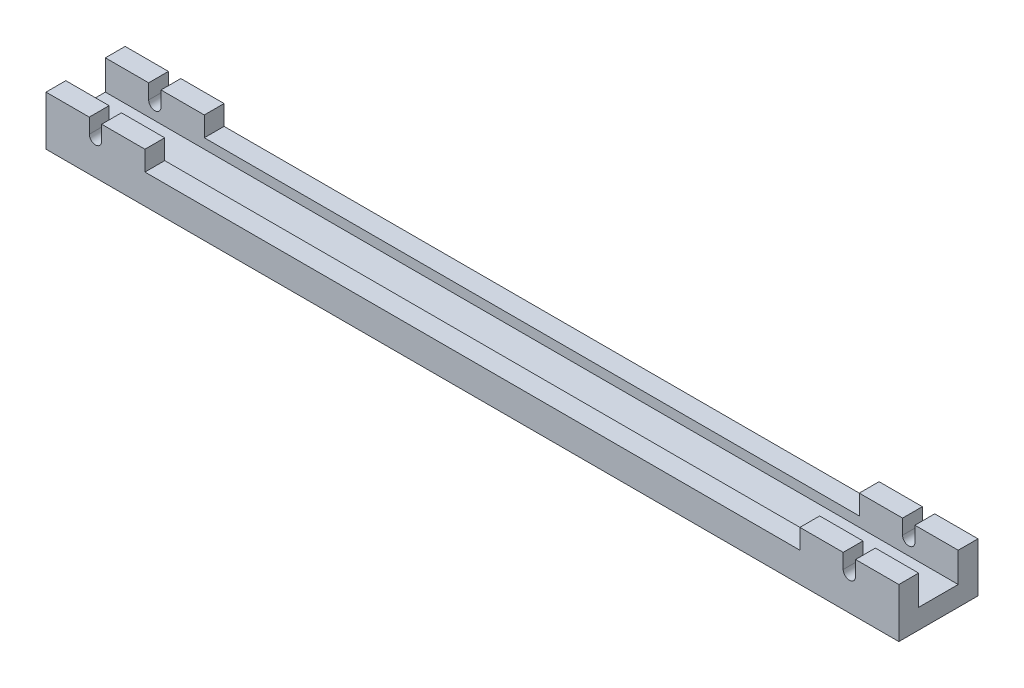
ISO-10303-21;
HEADER;
FILE_DESCRIPTION(('STEP AP214'),'2;1');
FILE_NAME('part.step','',(''),(''),'','','');
FILE_SCHEMA(('AUTOMOTIVE_DESIGN { 1 0 10303 214 1 1 1 1 }'));
ENDSEC;
DATA;
#1=APPLICATION_CONTEXT('core data for automotive mechanical design processes');
#2=APPLICATION_PROTOCOL_DEFINITION('international standard','automotive_design',2000,#1);
#3=PRODUCT_CONTEXT('',#1,'mechanical');
#4=PRODUCT('Part','Part','',(#3));
#5=PRODUCT_RELATED_PRODUCT_CATEGORY('part','',(#4));
#6=PRODUCT_DEFINITION_FORMATION('','',#4);
#7=PRODUCT_DEFINITION_CONTEXT('part definition',#1,'design');
#8=PRODUCT_DEFINITION('design','',#6,#7);
#9=PRODUCT_DEFINITION_SHAPE('','',#8);
#10=(LENGTH_UNIT() NAMED_UNIT(*) SI_UNIT(.MILLI.,.METRE.));
#11=(NAMED_UNIT(*) PLANE_ANGLE_UNIT() SI_UNIT($,.RADIAN.));
#12=(NAMED_UNIT(*) SI_UNIT($,.STERADIAN.) SOLID_ANGLE_UNIT());
#13=UNCERTAINTY_MEASURE_WITH_UNIT(LENGTH_MEASURE(1.E-05),#10,'distance_accuracy_value','');
#14=(GEOMETRIC_REPRESENTATION_CONTEXT(3) GLOBAL_UNCERTAINTY_ASSIGNED_CONTEXT((#13)) GLOBAL_UNIT_ASSIGNED_CONTEXT((#10,
#11,#12)) REPRESENTATION_CONTEXT('',''));
#15=CARTESIAN_POINT('',(0.,0.,0.));
#16=DIRECTION('',(0.,0.,1.));
#17=DIRECTION('',(1.,0.,0.));
#18=AXIS2_PLACEMENT_3D('',#15,#16,#17);
#19=CARTESIAN_POINT('',(0.,2.,4.));
#20=DIRECTION('',(0.,0.,-1.));
#21=DIRECTION('',(-1.,0.,0.));
#22=AXIS2_PLACEMENT_3D('',#19,#20,#21);
#23=PLANE('',#22);
#24=DIRECTION('',(0.,1.,0.));
#25=VECTOR('',#24,1.);
#26=CARTESIAN_POINT('',(-38.725,3.5,4.));
#27=LINE('',#26,#25);
#28=CARTESIAN_POINT('',(-38.725,3.5,4.));
#29=VERTEX_POINT('',#28);
#30=CARTESIAN_POINT('',(-38.725,5.,4.));
#31=VERTEX_POINT('',#30);
#32=EDGE_CURVE('E260',#29,#31,#27,.T.);
#33=ORIENTED_EDGE('',*,*,#32,.T.);
#34=DIRECTION('',(-1.,0.,0.));
#35=VECTOR('',#34,1.);
#36=CARTESIAN_POINT('',(-43.1,5.,4.));
#37=LINE('',#36,#35);
#38=CARTESIAN_POINT('',(-43.1,5.,4.));
#39=VERTEX_POINT('',#38);
#40=EDGE_CURVE('E317',#31,#39,#37,.T.);
#41=ORIENTED_EDGE('',*,*,#40,.T.);
#42=DIRECTION('',(0.,-1.,0.));
#43=VECTOR('',#42,1.);
#44=CARTESIAN_POINT('',(-43.1,2.,4.));
#45=LINE('',#44,#43);
#46=CARTESIAN_POINT('',(-43.1,0.,4.));
#47=VERTEX_POINT('',#46);
#48=EDGE_CURVE('E341',#39,#47,#45,.T.);
#49=ORIENTED_EDGE('',*,*,#48,.T.);
#50=DIRECTION('',(1.,0.,0.));
#51=VECTOR('',#50,1.);
#52=CARTESIAN_POINT('',(0.,0.,4.));
#53=LINE('',#52,#51);
#54=CARTESIAN_POINT('',(43.1,0.,4.));
#55=VERTEX_POINT('',#54);
#56=EDGE_CURVE('E457',#47,#55,#53,.T.);
#57=ORIENTED_EDGE('',*,*,#56,.T.);
#58=DIRECTION('',(0.,-1.,0.));
#59=VECTOR('',#58,1.);
#60=CARTESIAN_POINT('',(43.1,2.,4.));
#61=LINE('',#60,#59);
#62=CARTESIAN_POINT('',(43.1,5.,4.));
#63=VERTEX_POINT('',#62);
#64=EDGE_CURVE('E469',#63,#55,#61,.T.);
#65=ORIENTED_EDGE('',*,*,#64,.F.);
#66=DIRECTION('',(1.,0.,0.));
#67=VECTOR('',#66,1.);
#68=CARTESIAN_POINT('',(43.1,5.,4.));
#69=LINE('',#68,#67);
#70=CARTESIAN_POINT('',(38.725,5.,4.));
#71=VERTEX_POINT('',#70);
#72=EDGE_CURVE('E444',#71,#63,#69,.T.);
#73=ORIENTED_EDGE('',*,*,#72,.F.);
#74=DIRECTION('',(0.,1.,0.));
#75=VECTOR('',#74,1.);
#76=CARTESIAN_POINT('',(38.725,3.5,4.));
#77=LINE('',#76,#75);
#78=CARTESIAN_POINT('',(38.725,3.5,4.));
#79=VERTEX_POINT('',#78);
#80=EDGE_CURVE('E363',#79,#71,#77,.T.);
#81=ORIENTED_EDGE('',*,*,#80,.F.);
#82=CARTESIAN_POINT('',(38.1,3.5,4.));
#83=DIRECTION('',(0.,0.,1.));
#84=DIRECTION('',(1.,0.,0.));
#85=AXIS2_PLACEMENT_3D('',#82,#83,#84);
#86=CIRCLE('',#85,0.625000000000001);
#87=CARTESIAN_POINT('',(37.475,3.5,4.));
#88=VERTEX_POINT('',#87);
#89=EDGE_CURVE('E349',#88,#79,#86,.T.);
#90=ORIENTED_EDGE('',*,*,#89,.F.);
#91=DIRECTION('',(0.,-1.,0.));
#92=VECTOR('',#91,1.);
#93=CARTESIAN_POINT('',(37.475,3.5,4.));
#94=LINE('',#93,#92);
#95=CARTESIAN_POINT('',(37.475,5.,4.));
#96=VERTEX_POINT('',#95);
#97=EDGE_CURVE('E354',#96,#88,#94,.T.);
#98=ORIENTED_EDGE('',*,*,#97,.F.);
#99=CARTESIAN_POINT('',(33.1,5.,4.));
#100=VERTEX_POINT('',#99);
#101=EDGE_CURVE('E445',#100,#96,#69,.T.);
#102=ORIENTED_EDGE('',*,*,#101,.F.);
#103=DIRECTION('',(0.,-1.,0.));
#104=VECTOR('',#103,1.);
#105=CARTESIAN_POINT('',(33.1,5.,4.));
#106=LINE('',#105,#104);
#107=CARTESIAN_POINT('',(33.1,3.,4.));
#108=VERTEX_POINT('',#107);
#109=EDGE_CURVE('E448',#100,#108,#106,.T.);
#110=ORIENTED_EDGE('',*,*,#109,.T.);
#111=DIRECTION('',(1.,0.,0.));
#112=VECTOR('',#111,1.);
#113=CARTESIAN_POINT('',(0.,3.,4.));
#114=LINE('',#113,#112);
#115=CARTESIAN_POINT('',(-33.1,3.,4.));
#116=VERTEX_POINT('',#115);
#117=EDGE_CURVE('E402',#116,#108,#114,.T.);
#118=ORIENTED_EDGE('',*,*,#117,.F.);
#119=DIRECTION('',(0.,-1.,0.));
#120=VECTOR('',#119,1.);
#121=CARTESIAN_POINT('',(-33.1,5.,4.));
#122=LINE('',#121,#120);
#123=CARTESIAN_POINT('',(-33.1,5.,4.));
#124=VERTEX_POINT('',#123);
#125=EDGE_CURVE('E334',#124,#116,#122,.T.);
#126=ORIENTED_EDGE('',*,*,#125,.F.);
#127=CARTESIAN_POINT('',(-37.475,5.,4.));
#128=VERTEX_POINT('',#127);
#129=EDGE_CURVE('E318',#124,#128,#37,.T.);
#130=ORIENTED_EDGE('',*,*,#129,.T.);
#131=DIRECTION('',(0.,-1.,0.));
#132=VECTOR('',#131,1.);
#133=CARTESIAN_POINT('',(-37.475,3.5,4.));
#134=LINE('',#133,#132);
#135=CARTESIAN_POINT('',(-37.475,3.5,4.));
#136=VERTEX_POINT('',#135);
#137=EDGE_CURVE('E46',#128,#136,#134,.T.);
#138=ORIENTED_EDGE('',*,*,#137,.T.);
#139=CARTESIAN_POINT('',(-38.1,3.5,4.));
#140=DIRECTION('',(0.,0.,-1.));
#141=DIRECTION('',(-1.,0.,0.));
#142=AXIS2_PLACEMENT_3D('',#139,#140,#141);
#143=CIRCLE('',#142,0.625000000000001);
#144=EDGE_CURVE('E266',#136,#29,#143,.T.);
#145=ORIENTED_EDGE('',*,*,#144,.T.);
#146=EDGE_LOOP('',(#33,#41,#49,#57,#65,#73,#81,#90,#98,#102,#110,#118,#126,#130,#138,#145));
#147=FACE_BOUND('',#146,.T.);
#148=ADVANCED_FACE('F32',(#147),#23,.F.);
#149=CARTESIAN_POINT('',(0.,2.,-4.));
#150=DIRECTION('',(0.,0.,1.));
#151=DIRECTION('',(1.,0.,0.));
#152=AXIS2_PLACEMENT_3D('',#149,#150,#151);
#153=PLANE('',#152);
#154=DIRECTION('',(0.,1.,0.));
#155=VECTOR('',#154,1.);
#156=CARTESIAN_POINT('',(-38.725,3.5,-4.));
#157=LINE('',#156,#155);
#158=CARTESIAN_POINT('',(-38.725,3.5,-4.));
#159=VERTEX_POINT('',#158);
#160=CARTESIAN_POINT('',(-38.725,5.,-4.));
#161=VERTEX_POINT('',#160);
#162=EDGE_CURVE('E246',#159,#161,#157,.T.);
#163=ORIENTED_EDGE('',*,*,#162,.F.);
#164=CARTESIAN_POINT('',(-38.1,3.5,-4.));
#165=DIRECTION('',(0.,0.,-1.));
#166=DIRECTION('',(-1.,0.,0.));
#167=AXIS2_PLACEMENT_3D('',#164,#165,#166);
#168=CIRCLE('',#167,0.625000000000001);
#169=CARTESIAN_POINT('',(-37.475,3.5,-4.));
#170=VERTEX_POINT('',#169);
#171=EDGE_CURVE('E247',#170,#159,#168,.T.);
#172=ORIENTED_EDGE('',*,*,#171,.F.);
#173=DIRECTION('',(0.,-1.,0.));
#174=VECTOR('',#173,1.);
#175=CARTESIAN_POINT('',(-37.475,3.5,-4.));
#176=LINE('',#175,#174);
#177=CARTESIAN_POINT('',(-37.475,5.,-4.));
#178=VERTEX_POINT('',#177);
#179=EDGE_CURVE('E238',#178,#170,#176,.T.);
#180=ORIENTED_EDGE('',*,*,#179,.F.);
#181=DIRECTION('',(1.,0.,0.));
#182=VECTOR('',#181,1.);
#183=CARTESIAN_POINT('',(-43.1,5.,-4.));
#184=LINE('',#183,#182);
#185=CARTESIAN_POINT('',(-33.1,5.,-4.));
#186=VERTEX_POINT('',#185);
#187=EDGE_CURVE('E302',#178,#186,#184,.T.);
#188=ORIENTED_EDGE('',*,*,#187,.T.);
#189=DIRECTION('',(0.,-1.,0.));
#190=VECTOR('',#189,1.);
#191=CARTESIAN_POINT('',(-33.1,5.,-4.));
#192=LINE('',#191,#190);
#193=CARTESIAN_POINT('',(-33.1,3.,-4.));
#194=VERTEX_POINT('',#193);
#195=EDGE_CURVE('E305',#186,#194,#192,.T.);
#196=ORIENTED_EDGE('',*,*,#195,.T.);
#197=DIRECTION('',(-1.,0.,0.));
#198=VECTOR('',#197,1.);
#199=CARTESIAN_POINT('',(0.,3.,-4.));
#200=LINE('',#199,#198);
#201=CARTESIAN_POINT('',(33.1,3.,-4.));
#202=VERTEX_POINT('',#201);
#203=EDGE_CURVE('E400',#202,#194,#200,.T.);
#204=ORIENTED_EDGE('',*,*,#203,.F.);
#205=DIRECTION('',(0.,-1.,0.));
#206=VECTOR('',#205,1.);
#207=CARTESIAN_POINT('',(33.1,5.,-4.));
#208=LINE('',#207,#206);
#209=CARTESIAN_POINT('',(33.1,5.,-4.));
#210=VERTEX_POINT('',#209);
#211=EDGE_CURVE('E431',#210,#202,#208,.T.);
#212=ORIENTED_EDGE('',*,*,#211,.F.);
#213=DIRECTION('',(-1.,0.,0.));
#214=VECTOR('',#213,1.);
#215=CARTESIAN_POINT('',(43.1,5.,-4.));
#216=LINE('',#215,#214);
#217=CARTESIAN_POINT('',(37.475,5.,-4.));
#218=VERTEX_POINT('',#217);
#219=EDGE_CURVE('E414',#218,#210,#216,.T.);
#220=ORIENTED_EDGE('',*,*,#219,.F.);
#221=DIRECTION('',(0.,-1.,0.));
#222=VECTOR('',#221,1.);
#223=CARTESIAN_POINT('',(37.475,3.5,-4.));
#224=LINE('',#223,#222);
#225=CARTESIAN_POINT('',(37.475,3.5,-4.));
#226=VERTEX_POINT('',#225);
#227=EDGE_CURVE('E357',#218,#226,#224,.T.);
#228=ORIENTED_EDGE('',*,*,#227,.T.);
#229=CARTESIAN_POINT('',(38.1,3.5,-4.));
#230=DIRECTION('',(0.,0.,1.));
#231=DIRECTION('',(1.,0.,0.));
#232=AXIS2_PLACEMENT_3D('',#229,#230,#231);
#233=CIRCLE('',#232,0.625000000000001);
#234=CARTESIAN_POINT('',(38.725,3.5,-4.));
#235=VERTEX_POINT('',#234);
#236=EDGE_CURVE('E350',#226,#235,#233,.T.);
#237=ORIENTED_EDGE('',*,*,#236,.T.);
#238=DIRECTION('',(0.,1.,0.));
#239=VECTOR('',#238,1.);
#240=CARTESIAN_POINT('',(38.725,3.5,-4.));
#241=LINE('',#240,#239);
#242=CARTESIAN_POINT('',(38.725,5.,-4.));
#243=VERTEX_POINT('',#242);
#244=EDGE_CURVE('E353',#235,#243,#241,.T.);
#245=ORIENTED_EDGE('',*,*,#244,.T.);
#246=CARTESIAN_POINT('',(43.1,5.,-4.));
#247=VERTEX_POINT('',#246);
#248=EDGE_CURVE('E415',#247,#243,#216,.T.);
#249=ORIENTED_EDGE('',*,*,#248,.F.);
#250=DIRECTION('',(0.,-1.,0.));
#251=VECTOR('',#250,1.);
#252=CARTESIAN_POINT('',(43.1,2.,-4.));
#253=LINE('',#252,#251);
#254=CARTESIAN_POINT('',(43.1,0.,-4.));
#255=VERTEX_POINT('',#254);
#256=EDGE_CURVE('E461',#247,#255,#253,.T.);
#257=ORIENTED_EDGE('',*,*,#256,.T.);
#258=DIRECTION('',(-1.,0.,0.));
#259=VECTOR('',#258,1.);
#260=CARTESIAN_POINT('',(0.,0.,-4.));
#261=LINE('',#260,#259);
#262=CARTESIAN_POINT('',(-43.1,0.,-4.));
#263=VERTEX_POINT('',#262);
#264=EDGE_CURVE('E462',#255,#263,#261,.T.);
#265=ORIENTED_EDGE('',*,*,#264,.T.);
#266=DIRECTION('',(0.,-1.,0.));
#267=VECTOR('',#266,1.);
#268=CARTESIAN_POINT('',(-43.1,2.,-4.));
#269=LINE('',#268,#267);
#270=CARTESIAN_POINT('',(-43.1,5.,-4.));
#271=VERTEX_POINT('',#270);
#272=EDGE_CURVE('E346',#271,#263,#269,.T.);
#273=ORIENTED_EDGE('',*,*,#272,.F.);
#274=EDGE_CURVE('E303',#271,#161,#184,.T.);
#275=ORIENTED_EDGE('',*,*,#274,.T.);
#276=EDGE_LOOP('',(#163,#172,#180,#188,#196,#204,#212,#220,#228,#237,#245,#249,#257,#265,#273,#275));
#277=FACE_BOUND('',#276,.T.);
#278=ADVANCED_FACE('F258',(#277),#153,.F.);
#279=CARTESIAN_POINT('',(43.1,5.,2.));
#280=DIRECTION('',(0.,0.,1.));
#281=DIRECTION('',(1.,0.,0.));
#282=AXIS2_PLACEMENT_3D('',#279,#280,#281);
#283=PLANE('',#282);
#284=DIRECTION('',(0.,1.,0.));
#285=VECTOR('',#284,1.);
#286=CARTESIAN_POINT('',(-38.725,5.,2.00000000000001));
#287=LINE('',#286,#285);
#288=CARTESIAN_POINT('',(-38.725,3.5,2.00000000000001));
#289=VERTEX_POINT('',#288);
#290=CARTESIAN_POINT('',(-38.725,5.,2.));
#291=VERTEX_POINT('',#290);
#292=EDGE_CURVE('E282',#289,#291,#287,.T.);
#293=ORIENTED_EDGE('',*,*,#292,.F.);
#294=CARTESIAN_POINT('',(-38.1,3.5,2.00000000000001));
#295=DIRECTION('',(0.,0.,1.));
#296=DIRECTION('',(1.,0.,0.));
#297=AXIS2_PLACEMENT_3D('',#294,#295,#296);
#298=CIRCLE('',#297,0.625000000000001);
#299=CARTESIAN_POINT('',(-37.475,3.5,2.00000000000001));
#300=VERTEX_POINT('',#299);
#301=EDGE_CURVE('E284',#300,#289,#298,.F.);
#302=ORIENTED_EDGE('',*,*,#301,.F.);
#303=DIRECTION('',(0.,-1.,0.));
#304=VECTOR('',#303,1.);
#305=CARTESIAN_POINT('',(-37.475,5.,2.00000000000001));
#306=LINE('',#305,#304);
#307=CARTESIAN_POINT('',(-37.475,5.,2.));
#308=VERTEX_POINT('',#307);
#309=EDGE_CURVE('E278',#308,#300,#306,.T.);
#310=ORIENTED_EDGE('',*,*,#309,.F.);
#311=DIRECTION('',(1.,0.,0.));
#312=VECTOR('',#311,1.);
#313=CARTESIAN_POINT('',(-43.1,5.,2.));
#314=LINE('',#313,#312);
#315=CARTESIAN_POINT('',(-33.1,5.,2.));
#316=VERTEX_POINT('',#315);
#317=EDGE_CURVE('E324',#308,#316,#314,.T.);
#318=ORIENTED_EDGE('',*,*,#317,.T.);
#319=DIRECTION('',(0.,-1.,0.));
#320=VECTOR('',#319,1.);
#321=CARTESIAN_POINT('',(-33.1,5.,2.));
#322=LINE('',#321,#320);
#323=CARTESIAN_POINT('',(-33.1,3.,2.));
#324=VERTEX_POINT('',#323);
#325=EDGE_CURVE('E331',#316,#324,#322,.T.);
#326=ORIENTED_EDGE('',*,*,#325,.T.);
#327=DIRECTION('',(-1.,0.,0.));
#328=VECTOR('',#327,1.);
#329=CARTESIAN_POINT('',(0.,3.,2.));
#330=LINE('',#329,#328);
#331=CARTESIAN_POINT('',(33.1,3.,2.));
#332=VERTEX_POINT('',#331);
#333=EDGE_CURVE('E408',#332,#324,#330,.T.);
#334=ORIENTED_EDGE('',*,*,#333,.F.);
#335=DIRECTION('',(0.,-1.,0.));
#336=VECTOR('',#335,1.);
#337=CARTESIAN_POINT('',(33.1,5.,2.));
#338=LINE('',#337,#336);
#339=CARTESIAN_POINT('',(33.1,5.,2.));
#340=VERTEX_POINT('',#339);
#341=EDGE_CURVE('E452',#340,#332,#338,.T.);
#342=ORIENTED_EDGE('',*,*,#341,.F.);
#343=DIRECTION('',(-1.,0.,0.));
#344=VECTOR('',#343,1.);
#345=CARTESIAN_POINT('',(43.1,5.,2.));
#346=LINE('',#345,#344);
#347=CARTESIAN_POINT('',(37.475,5.,2.));
#348=VERTEX_POINT('',#347);
#349=EDGE_CURVE('E438',#348,#340,#346,.T.);
#350=ORIENTED_EDGE('',*,*,#349,.F.);
#351=DIRECTION('',(0.,-1.,0.));
#352=VECTOR('',#351,1.);
#353=CARTESIAN_POINT('',(37.475,5.,2.));
#354=LINE('',#353,#352);
#355=CARTESIAN_POINT('',(37.475,3.5,2.));
#356=VERTEX_POINT('',#355);
#357=EDGE_CURVE('E390',#348,#356,#354,.T.);
#358=ORIENTED_EDGE('',*,*,#357,.T.);
#359=CARTESIAN_POINT('',(38.1,3.5,2.));
#360=DIRECTION('',(0.,0.,1.));
#361=DIRECTION('',(1.,0.,0.));
#362=AXIS2_PLACEMENT_3D('',#359,#360,#361);
#363=CIRCLE('',#362,0.625000000000001);
#364=CARTESIAN_POINT('',(38.725,3.5,2.));
#365=VERTEX_POINT('',#364);
#366=EDGE_CURVE('E393',#356,#365,#363,.T.);
#367=ORIENTED_EDGE('',*,*,#366,.T.);
#368=DIRECTION('',(0.,1.,0.));
#369=VECTOR('',#368,1.);
#370=CARTESIAN_POINT('',(38.725,5.,2.));
#371=LINE('',#370,#369);
#372=CARTESIAN_POINT('',(38.725,5.,2.));
#373=VERTEX_POINT('',#372);
#374=EDGE_CURVE('E384',#365,#373,#371,.T.);
#375=ORIENTED_EDGE('',*,*,#374,.T.);
#376=CARTESIAN_POINT('',(43.1,5.,2.));
#377=VERTEX_POINT('',#376);
#378=EDGE_CURVE('E439',#377,#373,#346,.T.);
#379=ORIENTED_EDGE('',*,*,#378,.F.);
#380=DIRECTION('',(0.,-1.,0.));
#381=VECTOR('',#380,1.);
#382=CARTESIAN_POINT('',(43.1,5.,2.));
#383=LINE('',#382,#381);
#384=CARTESIAN_POINT('',(43.1,2.,2.));
#385=VERTEX_POINT('',#384);
#386=EDGE_CURVE('E454',#377,#385,#383,.T.);
#387=ORIENTED_EDGE('',*,*,#386,.T.);
#388=DIRECTION('',(-1.,0.,0.));
#389=VECTOR('',#388,1.);
#390=CARTESIAN_POINT('',(43.1,2.,2.));
#391=LINE('',#390,#389);
#392=CARTESIAN_POINT('',(-43.1,2.,2.));
#393=VERTEX_POINT('',#392);
#394=EDGE_CURVE('E434',#385,#393,#391,.T.);
#395=ORIENTED_EDGE('',*,*,#394,.T.);
#396=DIRECTION('',(0.,-1.,0.));
#397=VECTOR('',#396,1.);
#398=CARTESIAN_POINT('',(-43.1,5.,2.));
#399=LINE('',#398,#397);
#400=CARTESIAN_POINT('',(-43.1,5.,2.));
#401=VERTEX_POINT('',#400);
#402=EDGE_CURVE('E328',#401,#393,#399,.T.);
#403=ORIENTED_EDGE('',*,*,#402,.F.);
#404=EDGE_CURVE('E325',#401,#291,#314,.T.);
#405=ORIENTED_EDGE('',*,*,#404,.T.);
#406=EDGE_LOOP('',(#293,#302,#310,#318,#326,#334,#342,#350,#358,#367,#375,#379,#387,#395,#403,#405));
#407=FACE_BOUND('',#406,.T.);
#408=ADVANCED_FACE('F529',(#407),#283,.F.);
#409=CARTESIAN_POINT('',(43.1,5.,-2.));
#410=DIRECTION('',(0.,0.,-1.));
#411=DIRECTION('',(-1.,0.,0.));
#412=AXIS2_PLACEMENT_3D('',#409,#410,#411);
#413=PLANE('',#412);
#414=DIRECTION('',(0.,-1.,0.));
#415=VECTOR('',#414,1.);
#416=CARTESIAN_POINT('',(-38.725,5.,-1.99999999999999));
#417=LINE('',#416,#415);
#418=CARTESIAN_POINT('',(-38.725,5.,-2.));
#419=VERTEX_POINT('',#418);
#420=CARTESIAN_POINT('',(-38.725,3.5,-1.99999999999999));
#421=VERTEX_POINT('',#420);
#422=EDGE_CURVE('E280',#419,#421,#417,.T.);
#423=ORIENTED_EDGE('',*,*,#422,.F.);
#424=DIRECTION('',(-1.,0.,0.));
#425=VECTOR('',#424,1.);
#426=CARTESIAN_POINT('',(-43.1,5.,-2.));
#427=LINE('',#426,#425);
#428=CARTESIAN_POINT('',(-43.1,5.,-2.));
#429=VERTEX_POINT('',#428);
#430=EDGE_CURVE('E295',#419,#429,#427,.T.);
#431=ORIENTED_EDGE('',*,*,#430,.T.);
#432=DIRECTION('',(0.,-1.,0.));
#433=VECTOR('',#432,1.);
#434=CARTESIAN_POINT('',(-43.1,5.,-2.));
#435=LINE('',#434,#433);
#436=CARTESIAN_POINT('',(-43.1,2.,-2.));
#437=VERTEX_POINT('',#436);
#438=EDGE_CURVE('E311',#429,#437,#435,.T.);
#439=ORIENTED_EDGE('',*,*,#438,.T.);
#440=DIRECTION('',(1.,0.,0.));
#441=VECTOR('',#440,1.);
#442=CARTESIAN_POINT('',(43.1,2.,-2.));
#443=LINE('',#442,#441);
#444=CARTESIAN_POINT('',(43.1,2.,-2.));
#445=VERTEX_POINT('',#444);
#446=EDGE_CURVE('E410',#437,#445,#443,.T.);
#447=ORIENTED_EDGE('',*,*,#446,.T.);
#448=DIRECTION('',(0.,-1.,0.));
#449=VECTOR('',#448,1.);
#450=CARTESIAN_POINT('',(43.1,5.,-2.));
#451=LINE('',#450,#449);
#452=CARTESIAN_POINT('',(43.1,5.,-2.));
#453=VERTEX_POINT('',#452);
#454=EDGE_CURVE('E424',#453,#445,#451,.T.);
#455=ORIENTED_EDGE('',*,*,#454,.F.);
#456=DIRECTION('',(1.,0.,0.));
#457=VECTOR('',#456,1.);
#458=CARTESIAN_POINT('',(43.1,5.,-2.));
#459=LINE('',#458,#457);
#460=CARTESIAN_POINT('',(38.725,5.,-2.));
#461=VERTEX_POINT('',#460);
#462=EDGE_CURVE('E420',#461,#453,#459,.T.);
#463=ORIENTED_EDGE('',*,*,#462,.F.);
#464=DIRECTION('',(0.,-1.,0.));
#465=VECTOR('',#464,1.);
#466=CARTESIAN_POINT('',(38.725,5.,-2.));
#467=LINE('',#466,#465);
#468=CARTESIAN_POINT('',(38.725,3.5,-2.));
#469=VERTEX_POINT('',#468);
#470=EDGE_CURVE('E370',#461,#469,#467,.T.);
#471=ORIENTED_EDGE('',*,*,#470,.T.);
#472=CARTESIAN_POINT('',(38.1,3.5,-2.));
#473=DIRECTION('',(0.,0.,-1.));
#474=DIRECTION('',(-1.,0.,0.));
#475=AXIS2_PLACEMENT_3D('',#472,#473,#474);
#476=CIRCLE('',#475,0.625000000000001);
#477=CARTESIAN_POINT('',(37.475,3.5,-2.));
#478=VERTEX_POINT('',#477);
#479=EDGE_CURVE('E39',#469,#478,#476,.T.);
#480=ORIENTED_EDGE('',*,*,#479,.T.);
#481=DIRECTION('',(0.,1.,0.));
#482=VECTOR('',#481,1.);
#483=CARTESIAN_POINT('',(37.475,5.,-2.));
#484=LINE('',#483,#482);
#485=CARTESIAN_POINT('',(37.475,5.,-2.));
#486=VERTEX_POINT('',#485);
#487=EDGE_CURVE('E387',#478,#486,#484,.T.);
#488=ORIENTED_EDGE('',*,*,#487,.T.);
#489=CARTESIAN_POINT('',(33.1,5.,-2.));
#490=VERTEX_POINT('',#489);
#491=EDGE_CURVE('E421',#490,#486,#459,.T.);
#492=ORIENTED_EDGE('',*,*,#491,.F.);
#493=DIRECTION('',(0.,-1.,0.));
#494=VECTOR('',#493,1.);
#495=CARTESIAN_POINT('',(33.1,5.,-2.));
#496=LINE('',#495,#494);
#497=CARTESIAN_POINT('',(33.1,3.,-2.));
#498=VERTEX_POINT('',#497);
#499=EDGE_CURVE('E428',#490,#498,#496,.T.);
#500=ORIENTED_EDGE('',*,*,#499,.T.);
#501=DIRECTION('',(1.,0.,0.));
#502=VECTOR('',#501,1.);
#503=CARTESIAN_POINT('',(0.,3.,-2.));
#504=LINE('',#503,#502);
#505=CARTESIAN_POINT('',(-33.1,3.,-2.));
#506=VERTEX_POINT('',#505);
#507=EDGE_CURVE('E396',#506,#498,#504,.T.);
#508=ORIENTED_EDGE('',*,*,#507,.F.);
#509=DIRECTION('',(0.,-1.,0.));
#510=VECTOR('',#509,1.);
#511=CARTESIAN_POINT('',(-33.1,5.,-2.));
#512=LINE('',#511,#510);
#513=CARTESIAN_POINT('',(-33.1,5.,-2.));
#514=VERTEX_POINT('',#513);
#515=EDGE_CURVE('E308',#514,#506,#512,.T.);
#516=ORIENTED_EDGE('',*,*,#515,.F.);
#517=CARTESIAN_POINT('',(-37.475,5.,-2.));
#518=VERTEX_POINT('',#517);
#519=EDGE_CURVE('E296',#514,#518,#427,.T.);
#520=ORIENTED_EDGE('',*,*,#519,.T.);
#521=DIRECTION('',(0.,1.,0.));
#522=VECTOR('',#521,1.);
#523=CARTESIAN_POINT('',(-37.475,5.,-1.99999999999999));
#524=LINE('',#523,#522);
#525=CARTESIAN_POINT('',(-37.475,3.5,-1.99999999999999));
#526=VERTEX_POINT('',#525);
#527=EDGE_CURVE('E54',#526,#518,#524,.T.);
#528=ORIENTED_EDGE('',*,*,#527,.F.);
#529=CARTESIAN_POINT('',(-38.1,3.5,-1.99999999999999));
#530=DIRECTION('',(0.,0.,-1.));
#531=DIRECTION('',(-1.,0.,0.));
#532=AXIS2_PLACEMENT_3D('',#529,#530,#531);
#533=CIRCLE('',#532,0.625000000000001);
#534=EDGE_CURVE('E11',#421,#526,#533,.F.);
#535=ORIENTED_EDGE('',*,*,#534,.F.);
#536=EDGE_LOOP('',(#423,#431,#439,#447,#455,#463,#471,#480,#488,#492,#500,#508,#516,#520,#528,#535));
#537=FACE_BOUND('',#536,.T.);
#538=ADVANCED_FACE('F474',(#537),#413,.F.);
#539=CARTESIAN_POINT('',(0.,5.,0.));
#540=DIRECTION('',(0.,1.,0.));
#541=DIRECTION('',(0.,0.,1.));
#542=AXIS2_PLACEMENT_3D('',#539,#540,#541);
#543=PLANE('',#542);
#544=ORIENTED_EDGE('',*,*,#40,.F.);
#545=DIRECTION('',(0.,0.,1.));
#546=VECTOR('',#545,1.);
#547=CARTESIAN_POINT('',(-38.725,5.,-4.));
#548=LINE('',#547,#546);
#549=EDGE_CURVE('E275',#291,#31,#548,.T.);
#550=ORIENTED_EDGE('',*,*,#549,.F.);
#551=ORIENTED_EDGE('',*,*,#404,.F.);
#552=DIRECTION('',(0.,0.,-1.));
#553=VECTOR('',#552,1.);
#554=CARTESIAN_POINT('',(-43.1,5.,4.));
#555=LINE('',#554,#553);
#556=EDGE_CURVE('E314',#39,#401,#555,.T.);
#557=ORIENTED_EDGE('',*,*,#556,.F.);
#558=EDGE_LOOP('',(#544,#550,#551,#557));
#559=FACE_BOUND('',#558,.T.);
#560=ADVANCED_FACE('F536',(#559),#543,.T.);
#561=ORIENTED_EDGE('',*,*,#317,.F.);
#562=DIRECTION('',(0.,0.,1.));
#563=VECTOR('',#562,1.);
#564=CARTESIAN_POINT('',(-37.475,5.,-4.));
#565=LINE('',#564,#563);
#566=EDGE_CURVE('E254',#308,#128,#565,.T.);
#567=ORIENTED_EDGE('',*,*,#566,.T.);
#568=ORIENTED_EDGE('',*,*,#129,.F.);
#569=DIRECTION('',(0.,0.,1.));
#570=VECTOR('',#569,1.);
#571=CARTESIAN_POINT('',(-33.1,5.,4.));
#572=LINE('',#571,#570);
#573=EDGE_CURVE('E321',#316,#124,#572,.T.);
#574=ORIENTED_EDGE('',*,*,#573,.F.);
#575=EDGE_LOOP('',(#561,#567,#568,#574));
#576=FACE_BOUND('',#575,.T.);
#577=ADVANCED_FACE('F552',(#576),#543,.T.);
#578=CARTESIAN_POINT('',(0.,5.,0.));
#579=DIRECTION('',(0.,-1.,0.));
#580=DIRECTION('',(0.,0.,-1.));
#581=AXIS2_PLACEMENT_3D('',#578,#579,#580);
#582=PLANE('',#581);
#583=EDGE_CURVE('E273',#161,#419,#548,.T.);
#584=ORIENTED_EDGE('',*,*,#583,.F.);
#585=ORIENTED_EDGE('',*,*,#274,.F.);
#586=DIRECTION('',(0.,0.,-1.));
#587=VECTOR('',#586,1.);
#588=CARTESIAN_POINT('',(-43.1,5.,-4.));
#589=LINE('',#588,#587);
#590=EDGE_CURVE('E292',#429,#271,#589,.T.);
#591=ORIENTED_EDGE('',*,*,#590,.F.);
#592=ORIENTED_EDGE('',*,*,#430,.F.);
#593=EDGE_LOOP('',(#584,#585,#591,#592));
#594=FACE_BOUND('',#593,.T.);
#595=ADVANCED_FACE('F513',(#594),#582,.F.);
#596=EDGE_CURVE('E242',#178,#518,#565,.T.);
#597=ORIENTED_EDGE('',*,*,#596,.T.);
#598=ORIENTED_EDGE('',*,*,#519,.F.);
#599=DIRECTION('',(0.,0.,1.));
#600=VECTOR('',#599,1.);
#601=CARTESIAN_POINT('',(-33.1,5.,-4.));
#602=LINE('',#601,#600);
#603=EDGE_CURVE('E299',#186,#514,#602,.T.);
#604=ORIENTED_EDGE('',*,*,#603,.F.);
#605=ORIENTED_EDGE('',*,*,#187,.F.);
#606=EDGE_LOOP('',(#597,#598,#604,#605));
#607=FACE_BOUND('',#606,.T.);
#608=ADVANCED_FACE('F506',(#607),#582,.F.);
#609=CARTESIAN_POINT('',(-33.1,5.,4.));
#610=DIRECTION('',(1.,0.,0.));
#611=DIRECTION('',(0.,0.,-1.));
#612=AXIS2_PLACEMENT_3D('',#609,#610,#611);
#613=PLANE('',#612);
#614=ORIENTED_EDGE('',*,*,#125,.T.);
#615=DIRECTION('',(0.,0.,-1.));
#616=VECTOR('',#615,1.);
#617=CARTESIAN_POINT('',(-33.1,3.,4.));
#618=LINE('',#617,#616);
#619=EDGE_CURVE('E289',#116,#324,#618,.T.);
#620=ORIENTED_EDGE('',*,*,#619,.T.);
#621=ORIENTED_EDGE('',*,*,#325,.F.);
#622=ORIENTED_EDGE('',*,*,#573,.T.);
#623=EDGE_LOOP('',(#614,#620,#621,#622));
#624=FACE_BOUND('',#623,.T.);
#625=ADVANCED_FACE('F555',(#624),#613,.T.);
#626=CARTESIAN_POINT('',(0.,5.,0.));
#627=DIRECTION('',(0.,1.,0.));
#628=DIRECTION('',(0.,0.,1.));
#629=AXIS2_PLACEMENT_3D('',#626,#627,#628);
#630=PLANE('',#629);
#631=DIRECTION('',(0.,0.,1.));
#632=VECTOR('',#631,1.);
#633=CARTESIAN_POINT('',(37.475,5.,-4.));
#634=LINE('',#633,#632);
#635=EDGE_CURVE('E374',#348,#96,#634,.T.);
#636=ORIENTED_EDGE('',*,*,#635,.F.);
#637=ORIENTED_EDGE('',*,*,#349,.T.);
#638=DIRECTION('',(0.,0.,1.));
#639=VECTOR('',#638,1.);
#640=CARTESIAN_POINT('',(33.1,5.,4.));
#641=LINE('',#640,#639);
#642=EDGE_CURVE('E442',#340,#100,#641,.T.);
#643=ORIENTED_EDGE('',*,*,#642,.T.);
#644=ORIENTED_EDGE('',*,*,#101,.T.);
#645=EDGE_LOOP('',(#636,#637,#643,#644));
#646=FACE_BOUND('',#645,.T.);
#647=ADVANCED_FACE('F572',(#646),#630,.T.);
#648=CARTESIAN_POINT('',(0.,5.,0.));
#649=DIRECTION('',(0.,-1.,0.));
#650=DIRECTION('',(0.,0.,-1.));
#651=AXIS2_PLACEMENT_3D('',#648,#649,#650);
#652=PLANE('',#651);
#653=ORIENTED_EDGE('',*,*,#491,.T.);
#654=EDGE_CURVE('E372',#218,#486,#634,.T.);
#655=ORIENTED_EDGE('',*,*,#654,.F.);
#656=ORIENTED_EDGE('',*,*,#219,.T.);
#657=DIRECTION('',(0.,0.,1.));
#658=VECTOR('',#657,1.);
#659=CARTESIAN_POINT('',(33.1,5.,-4.));
#660=LINE('',#659,#658);
#661=EDGE_CURVE('E418',#210,#490,#660,.T.);
#662=ORIENTED_EDGE('',*,*,#661,.T.);
#663=EDGE_LOOP('',(#653,#655,#656,#662));
#664=FACE_BOUND('',#663,.T.);
#665=ADVANCED_FACE('F490',(#664),#652,.F.);
#666=CARTESIAN_POINT('',(0.,2.,0.));
#667=DIRECTION('',(0.,1.,0.));
#668=DIRECTION('',(0.,0.,1.));
#669=AXIS2_PLACEMENT_3D('',#666,#667,#668);
#670=PLANE('',#669);
#671=ORIENTED_EDGE('',*,*,#446,.F.);
#672=DIRECTION('',(0.,0.,-1.));
#673=VECTOR('',#672,1.);
#674=CARTESIAN_POINT('',(-43.1,2.,-4.));
#675=LINE('',#674,#673);
#676=EDGE_CURVE('E338',#393,#437,#675,.T.);
#677=ORIENTED_EDGE('',*,*,#676,.F.);
#678=ORIENTED_EDGE('',*,*,#394,.F.);
#679=DIRECTION('',(0.,0.,-1.));
#680=VECTOR('',#679,1.);
#681=CARTESIAN_POINT('',(43.1,2.,-4.));
#682=LINE('',#681,#680);
#683=EDGE_CURVE('E458',#385,#445,#682,.T.);
#684=ORIENTED_EDGE('',*,*,#683,.T.);
#685=EDGE_LOOP('',(#671,#677,#678,#684));
#686=FACE_BOUND('',#685,.T.);
#687=ADVANCED_FACE('F526',(#686),#670,.T.);
#688=CARTESIAN_POINT('',(33.1,5.,4.));
#689=DIRECTION('',(1.,0.,0.));
#690=DIRECTION('',(0.,0.,-1.));
#691=AXIS2_PLACEMENT_3D('',#688,#689,#690);
#692=PLANE('',#691);
#693=DIRECTION('',(0.,0.,-1.));
#694=VECTOR('',#693,1.);
#695=CARTESIAN_POINT('',(33.1,3.,4.));
#696=LINE('',#695,#694);
#697=EDGE_CURVE('E405',#108,#332,#696,.T.);
#698=ORIENTED_EDGE('',*,*,#697,.F.);
#699=ORIENTED_EDGE('',*,*,#109,.F.);
#700=ORIENTED_EDGE('',*,*,#642,.F.);
#701=ORIENTED_EDGE('',*,*,#341,.T.);
#702=EDGE_LOOP('',(#698,#699,#700,#701));
#703=FACE_BOUND('',#702,.T.);
#704=ADVANCED_FACE('F565',(#703),#692,.F.);
#705=CARTESIAN_POINT('',(43.1,2.,-4.));
#706=DIRECTION('',(-1.,0.,0.));
#707=DIRECTION('',(0.,0.,1.));
#708=AXIS2_PLACEMENT_3D('',#705,#706,#707);
#709=PLANE('',#708);
#710=DIRECTION('',(0.,0.,-1.));
#711=VECTOR('',#710,1.);
#712=CARTESIAN_POINT('',(43.1,0.,-4.));
#713=LINE('',#712,#711);
#714=EDGE_CURVE('E464',#55,#255,#713,.T.);
#715=ORIENTED_EDGE('',*,*,#714,.T.);
#716=ORIENTED_EDGE('',*,*,#256,.F.);
#717=DIRECTION('',(0.,0.,-1.));
#718=VECTOR('',#717,1.);
#719=CARTESIAN_POINT('',(43.1,5.,-4.));
#720=LINE('',#719,#718);
#721=EDGE_CURVE('E411',#453,#247,#720,.T.);
#722=ORIENTED_EDGE('',*,*,#721,.F.);
#723=ORIENTED_EDGE('',*,*,#454,.T.);
#724=ORIENTED_EDGE('',*,*,#683,.F.);
#725=ORIENTED_EDGE('',*,*,#386,.F.);
#726=DIRECTION('',(0.,0.,-1.));
#727=VECTOR('',#726,1.);
#728=CARTESIAN_POINT('',(43.1,5.,4.));
#729=LINE('',#728,#727);
#730=EDGE_CURVE('E435',#63,#377,#729,.T.);
#731=ORIENTED_EDGE('',*,*,#730,.F.);
#732=ORIENTED_EDGE('',*,*,#64,.T.);
#733=EDGE_LOOP('',(#715,#716,#722,#723,#724,#725,#731,#732));
#734=FACE_BOUND('',#733,.T.);
#735=ADVANCED_FACE('F524',(#734),#709,.F.);
#736=CARTESIAN_POINT('',(0.,0.,0.));
#737=DIRECTION('',(0.,1.,0.));
#738=DIRECTION('',(0.,0.,1.));
#739=AXIS2_PLACEMENT_3D('',#736,#737,#738);
#740=PLANE('',#739);
#741=ORIENTED_EDGE('',*,*,#56,.F.);
#742=DIRECTION('',(0.,0.,-1.));
#743=VECTOR('',#742,1.);
#744=CARTESIAN_POINT('',(-43.1,0.,-4.));
#745=LINE('',#744,#743);
#746=EDGE_CURVE('E337',#47,#263,#745,.T.);
#747=ORIENTED_EDGE('',*,*,#746,.T.);
#748=ORIENTED_EDGE('',*,*,#264,.F.);
#749=ORIENTED_EDGE('',*,*,#714,.F.);
#750=EDGE_LOOP('',(#741,#747,#748,#749));
#751=FACE_BOUND('',#750,.T.);
#752=ADVANCED_FACE('F591',(#751),#740,.F.);
#753=DIRECTION('',(0.,0.,1.));
#754=VECTOR('',#753,1.);
#755=CARTESIAN_POINT('',(38.725,5.,-4.));
#756=LINE('',#755,#754);
#757=EDGE_CURVE('E378',#373,#71,#756,.T.);
#758=ORIENTED_EDGE('',*,*,#757,.T.);
#759=ORIENTED_EDGE('',*,*,#72,.T.);
#760=ORIENTED_EDGE('',*,*,#730,.T.);
#761=ORIENTED_EDGE('',*,*,#378,.T.);
#762=EDGE_LOOP('',(#758,#759,#760,#761));
#763=FACE_BOUND('',#762,.T.);
#764=ADVANCED_FACE('F584',(#763),#630,.T.);
#765=CARTESIAN_POINT('',(33.1,5.,-4.));
#766=DIRECTION('',(1.,0.,0.));
#767=DIRECTION('',(0.,0.,-1.));
#768=AXIS2_PLACEMENT_3D('',#765,#766,#767);
#769=PLANE('',#768);
#770=ORIENTED_EDGE('',*,*,#211,.T.);
#771=DIRECTION('',(0.,0.,-1.));
#772=VECTOR('',#771,1.);
#773=CARTESIAN_POINT('',(33.1,3.,-4.));
#774=LINE('',#773,#772);
#775=EDGE_CURVE('E398',#498,#202,#774,.T.);
#776=ORIENTED_EDGE('',*,*,#775,.F.);
#777=ORIENTED_EDGE('',*,*,#499,.F.);
#778=ORIENTED_EDGE('',*,*,#661,.F.);
#779=EDGE_LOOP('',(#770,#776,#777,#778));
#780=FACE_BOUND('',#779,.T.);
#781=ADVANCED_FACE('F495',(#780),#769,.F.);
#782=ORIENTED_EDGE('',*,*,#248,.T.);
#783=EDGE_CURVE('E375',#243,#461,#756,.T.);
#784=ORIENTED_EDGE('',*,*,#783,.T.);
#785=ORIENTED_EDGE('',*,*,#462,.T.);
#786=ORIENTED_EDGE('',*,*,#721,.T.);
#787=EDGE_LOOP('',(#782,#784,#785,#786));
#788=FACE_BOUND('',#787,.T.);
#789=ADVANCED_FACE('F593',(#788),#652,.F.);
#790=CARTESIAN_POINT('',(0.,3.,0.));
#791=DIRECTION('',(0.,-1.,0.));
#792=DIRECTION('',(0.,0.,-1.));
#793=AXIS2_PLACEMENT_3D('',#790,#791,#792);
#794=PLANE('',#793);
#795=ORIENTED_EDGE('',*,*,#333,.T.);
#796=ORIENTED_EDGE('',*,*,#619,.F.);
#797=ORIENTED_EDGE('',*,*,#117,.T.);
#798=ORIENTED_EDGE('',*,*,#697,.T.);
#799=EDGE_LOOP('',(#795,#796,#797,#798));
#800=FACE_BOUND('',#799,.T.);
#801=ADVANCED_FACE('F562',(#800),#794,.F.);
#802=CARTESIAN_POINT('',(0.,3.,0.));
#803=DIRECTION('',(0.,1.,0.));
#804=DIRECTION('',(0.,0.,1.));
#805=AXIS2_PLACEMENT_3D('',#802,#803,#804);
#806=PLANE('',#805);
#807=ORIENTED_EDGE('',*,*,#203,.T.);
#808=DIRECTION('',(0.,0.,-1.));
#809=VECTOR('',#808,1.);
#810=CARTESIAN_POINT('',(-33.1,3.,-4.));
#811=LINE('',#810,#809);
#812=EDGE_CURVE('E286',#506,#194,#811,.T.);
#813=ORIENTED_EDGE('',*,*,#812,.F.);
#814=ORIENTED_EDGE('',*,*,#507,.T.);
#815=ORIENTED_EDGE('',*,*,#775,.T.);
#816=EDGE_LOOP('',(#807,#813,#814,#815));
#817=FACE_BOUND('',#816,.T.);
#818=ADVANCED_FACE('F498',(#817),#806,.T.);
#819=CARTESIAN_POINT('',(37.475,3.5,-4.));
#820=DIRECTION('',(-1.,0.,0.));
#821=DIRECTION('',(0.,0.,1.));
#822=AXIS2_PLACEMENT_3D('',#819,#820,#821);
#823=PLANE('',#822);
#824=DIRECTION('',(0.,0.,1.));
#825=VECTOR('',#824,1.);
#826=CARTESIAN_POINT('',(37.475,3.5,-4.));
#827=LINE('',#826,#825);
#828=EDGE_CURVE('E367',#226,#478,#827,.T.);
#829=ORIENTED_EDGE('',*,*,#828,.F.);
#830=ORIENTED_EDGE('',*,*,#227,.F.);
#831=ORIENTED_EDGE('',*,*,#654,.T.);
#832=ORIENTED_EDGE('',*,*,#487,.F.);
#833=EDGE_LOOP('',(#829,#830,#831,#832));
#834=FACE_BOUND('',#833,.T.);
#835=ADVANCED_FACE('F488',(#834),#823,.F.);
#836=CARTESIAN_POINT('',(38.725,3.5,-4.));
#837=DIRECTION('',(1.,0.,0.));
#838=DIRECTION('',(0.,0.,-1.));
#839=AXIS2_PLACEMENT_3D('',#836,#837,#838);
#840=PLANE('',#839);
#841=ORIENTED_EDGE('',*,*,#783,.F.);
#842=ORIENTED_EDGE('',*,*,#244,.F.);
#843=DIRECTION('',(0.,0.,1.));
#844=VECTOR('',#843,1.);
#845=CARTESIAN_POINT('',(38.725,3.5,-4.));
#846=LINE('',#845,#844);
#847=EDGE_CURVE('E379',#235,#469,#846,.T.);
#848=ORIENTED_EDGE('',*,*,#847,.T.);
#849=ORIENTED_EDGE('',*,*,#470,.F.);
#850=EDGE_LOOP('',(#841,#842,#848,#849));
#851=FACE_BOUND('',#850,.T.);
#852=ADVANCED_FACE('F482',(#851),#840,.F.);
#853=CARTESIAN_POINT('',(38.1,3.5,-4.));
#854=DIRECTION('',(0.,0.,1.));
#855=DIRECTION('',(1.,0.,0.));
#856=AXIS2_PLACEMENT_3D('',#853,#854,#855);
#857=CYLINDRICAL_SURFACE('',#856,0.625000000000001);
#858=ORIENTED_EDGE('',*,*,#847,.F.);
#859=ORIENTED_EDGE('',*,*,#236,.F.);
#860=ORIENTED_EDGE('',*,*,#828,.T.);
#861=ORIENTED_EDGE('',*,*,#479,.F.);
#862=EDGE_LOOP('',(#858,#859,#860,#861));
#863=FACE_BOUND('',#862,.T.);
#864=ADVANCED_FACE('F478',(#863),#857,.F.);
#865=EDGE_CURVE('E371',#356,#88,#827,.T.);
#866=ORIENTED_EDGE('',*,*,#865,.T.);
#867=ORIENTED_EDGE('',*,*,#89,.T.);
#868=EDGE_CURVE('E360',#365,#79,#846,.T.);
#869=ORIENTED_EDGE('',*,*,#868,.F.);
#870=ORIENTED_EDGE('',*,*,#366,.F.);
#871=EDGE_LOOP('',(#866,#867,#869,#870));
#872=FACE_BOUND('',#871,.T.);
#873=ADVANCED_FACE('F577',(#872),#857,.F.);
#874=ORIENTED_EDGE('',*,*,#635,.T.);
#875=ORIENTED_EDGE('',*,*,#97,.T.);
#876=ORIENTED_EDGE('',*,*,#865,.F.);
#877=ORIENTED_EDGE('',*,*,#357,.F.);
#878=EDGE_LOOP('',(#874,#875,#876,#877));
#879=FACE_BOUND('',#878,.T.);
#880=ADVANCED_FACE('F575',(#879),#823,.F.);
#881=ORIENTED_EDGE('',*,*,#868,.T.);
#882=ORIENTED_EDGE('',*,*,#80,.T.);
#883=ORIENTED_EDGE('',*,*,#757,.F.);
#884=ORIENTED_EDGE('',*,*,#374,.F.);
#885=EDGE_LOOP('',(#881,#882,#883,#884));
#886=FACE_BOUND('',#885,.T.);
#887=ADVANCED_FACE('F581',(#886),#840,.F.);
#888=CARTESIAN_POINT('',(-43.1,2.,-4.));
#889=DIRECTION('',(-1.,0.,0.));
#890=DIRECTION('',(0.,0.,1.));
#891=AXIS2_PLACEMENT_3D('',#888,#889,#890);
#892=PLANE('',#891);
#893=ORIENTED_EDGE('',*,*,#746,.F.);
#894=ORIENTED_EDGE('',*,*,#48,.F.);
#895=ORIENTED_EDGE('',*,*,#556,.T.);
#896=ORIENTED_EDGE('',*,*,#402,.T.);
#897=ORIENTED_EDGE('',*,*,#676,.T.);
#898=ORIENTED_EDGE('',*,*,#438,.F.);
#899=ORIENTED_EDGE('',*,*,#590,.T.);
#900=ORIENTED_EDGE('',*,*,#272,.T.);
#901=EDGE_LOOP('',(#893,#894,#895,#896,#897,#898,#899,#900));
#902=FACE_BOUND('',#901,.T.);
#903=ADVANCED_FACE('F517',(#902),#892,.T.);
#904=CARTESIAN_POINT('',(-33.1,5.,-4.));
#905=DIRECTION('',(1.,0.,0.));
#906=DIRECTION('',(0.,0.,-1.));
#907=AXIS2_PLACEMENT_3D('',#904,#905,#906);
#908=PLANE('',#907);
#909=ORIENTED_EDGE('',*,*,#812,.T.);
#910=ORIENTED_EDGE('',*,*,#195,.F.);
#911=ORIENTED_EDGE('',*,*,#603,.T.);
#912=ORIENTED_EDGE('',*,*,#515,.T.);
#913=EDGE_LOOP('',(#909,#910,#911,#912));
#914=FACE_BOUND('',#913,.T.);
#915=ADVANCED_FACE('F503',(#914),#908,.T.);
#916=CARTESIAN_POINT('',(-37.475,3.5,-4.));
#917=DIRECTION('',(-1.,0.,0.));
#918=DIRECTION('',(0.,0.,1.));
#919=AXIS2_PLACEMENT_3D('',#916,#917,#918);
#920=PLANE('',#919);
#921=ORIENTED_EDGE('',*,*,#527,.T.);
#922=ORIENTED_EDGE('',*,*,#596,.F.);
#923=ORIENTED_EDGE('',*,*,#179,.T.);
#924=DIRECTION('',(0.,0.,1.));
#925=VECTOR('',#924,1.);
#926=CARTESIAN_POINT('',(-37.475,3.5,-4.));
#927=LINE('',#926,#925);
#928=EDGE_CURVE('E241',#170,#526,#927,.T.);
#929=ORIENTED_EDGE('',*,*,#928,.T.);
#930=EDGE_LOOP('',(#921,#922,#923,#929));
#931=FACE_BOUND('',#930,.T.);
#932=ADVANCED_FACE('F240',(#931),#920,.T.);
#933=CARTESIAN_POINT('',(-38.725,3.5,-4.));
#934=DIRECTION('',(1.,0.,0.));
#935=DIRECTION('',(0.,0.,-1.));
#936=AXIS2_PLACEMENT_3D('',#933,#934,#935);
#937=PLANE('',#936);
#938=ORIENTED_EDGE('',*,*,#422,.T.);
#939=DIRECTION('',(0.,0.,1.));
#940=VECTOR('',#939,1.);
#941=CARTESIAN_POINT('',(-38.725,3.5,-4.));
#942=LINE('',#941,#940);
#943=EDGE_CURVE('E270',#159,#421,#942,.T.);
#944=ORIENTED_EDGE('',*,*,#943,.F.);
#945=ORIENTED_EDGE('',*,*,#162,.T.);
#946=ORIENTED_EDGE('',*,*,#583,.T.);
#947=EDGE_LOOP('',(#938,#944,#945,#946));
#948=FACE_BOUND('',#947,.T.);
#949=ADVANCED_FACE('F686',(#948),#937,.T.);
#950=CARTESIAN_POINT('',(-38.1,3.5,-4.));
#951=DIRECTION('',(0.,0.,1.));
#952=DIRECTION('',(1.,0.,0.));
#953=AXIS2_PLACEMENT_3D('',#950,#951,#952);
#954=CYLINDRICAL_SURFACE('',#953,0.625000000000001);
#955=ORIENTED_EDGE('',*,*,#534,.T.);
#956=ORIENTED_EDGE('',*,*,#928,.F.);
#957=ORIENTED_EDGE('',*,*,#171,.T.);
#958=ORIENTED_EDGE('',*,*,#943,.T.);
#959=EDGE_LOOP('',(#955,#956,#957,#958));
#960=FACE_BOUND('',#959,.T.);
#961=ADVANCED_FACE('F250',(#960),#954,.F.);
#962=ORIENTED_EDGE('',*,*,#301,.T.);
#963=EDGE_CURVE('E272',#289,#29,#942,.T.);
#964=ORIENTED_EDGE('',*,*,#963,.T.);
#965=ORIENTED_EDGE('',*,*,#144,.F.);
#966=EDGE_CURVE('E255',#300,#136,#927,.T.);
#967=ORIENTED_EDGE('',*,*,#966,.F.);
#968=EDGE_LOOP('',(#962,#964,#965,#967));
#969=FACE_BOUND('',#968,.T.);
#970=ADVANCED_FACE('F545',(#969),#954,.F.);
#971=ORIENTED_EDGE('',*,*,#292,.T.);
#972=ORIENTED_EDGE('',*,*,#549,.T.);
#973=ORIENTED_EDGE('',*,*,#32,.F.);
#974=ORIENTED_EDGE('',*,*,#963,.F.);
#975=EDGE_LOOP('',(#971,#972,#973,#974));
#976=FACE_BOUND('',#975,.T.);
#977=ADVANCED_FACE('F541',(#976),#937,.T.);
#978=ORIENTED_EDGE('',*,*,#309,.T.);
#979=ORIENTED_EDGE('',*,*,#966,.T.);
#980=ORIENTED_EDGE('',*,*,#137,.F.);
#981=ORIENTED_EDGE('',*,*,#566,.F.);
#982=EDGE_LOOP('',(#978,#979,#980,#981));
#983=FACE_BOUND('',#982,.T.);
#984=ADVANCED_FACE('F547',(#983),#920,.T.);
#985=CLOSED_SHELL('',(#148,#278,#408,#538,#560,#577,#595,#608,#625,#647,#665,#687,#704,#735,
#752,#764,#781,#789,#801,#818,#835,#852,#864,#873,#880,#887,#903,#915,#932,#949,#961,#970,#977,#984));
#986=MANIFOLD_SOLID_BREP('B2',#985);
#987=ADVANCED_BREP_SHAPE_REPRESENTATION('',(#18,#986),#14);
#988=SHAPE_DEFINITION_REPRESENTATION(#9,#987);
ENDSEC;
END-ISO-10303-21;
